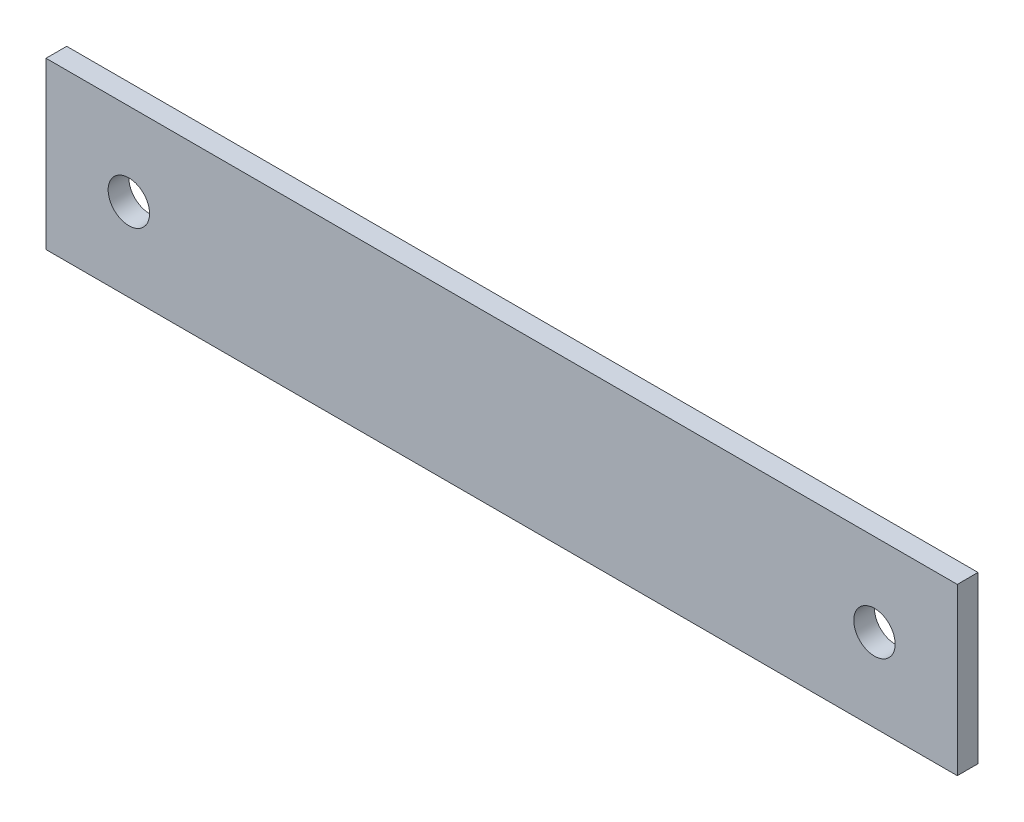
ISO-10303-21;
HEADER;
FILE_DESCRIPTION(('STEP AP214'),'2;1');
FILE_NAME('part.step','',(''),(''),'','','');
FILE_SCHEMA(('AUTOMOTIVE_DESIGN { 1 0 10303 214 1 1 1 1 }'));
ENDSEC;
DATA;
#1=APPLICATION_CONTEXT('core data for automotive mechanical design processes');
#2=APPLICATION_PROTOCOL_DEFINITION('international standard','automotive_design',2000,#1);
#3=PRODUCT_CONTEXT('',#1,'mechanical');
#4=PRODUCT('Part','Part','',(#3));
#5=PRODUCT_RELATED_PRODUCT_CATEGORY('part','',(#4));
#6=PRODUCT_DEFINITION_FORMATION('','',#4);
#7=PRODUCT_DEFINITION_CONTEXT('part definition',#1,'design');
#8=PRODUCT_DEFINITION('design','',#6,#7);
#9=PRODUCT_DEFINITION_SHAPE('','',#8);
#10=(LENGTH_UNIT() NAMED_UNIT(*) SI_UNIT(.MILLI.,.METRE.));
#11=(NAMED_UNIT(*) PLANE_ANGLE_UNIT() SI_UNIT($,.RADIAN.));
#12=(NAMED_UNIT(*) SI_UNIT($,.STERADIAN.) SOLID_ANGLE_UNIT());
#13=UNCERTAINTY_MEASURE_WITH_UNIT(LENGTH_MEASURE(1.E-05),#10,'distance_accuracy_value','');
#14=(GEOMETRIC_REPRESENTATION_CONTEXT(3) GLOBAL_UNCERTAINTY_ASSIGNED_CONTEXT((#13)) GLOBAL_UNIT_ASSIGNED_CONTEXT((#10,
#11,#12)) REPRESENTATION_CONTEXT('',''));
#15=CARTESIAN_POINT('',(0.,0.,0.));
#16=DIRECTION('',(0.,0.,1.));
#17=DIRECTION('',(1.,0.,0.));
#18=AXIS2_PLACEMENT_3D('',#15,#16,#17);
#19=CARTESIAN_POINT('',(0.,0.,3.175));
#20=DIRECTION('',(0.,0.,-1.));
#21=DIRECTION('',(-1.,0.,0.));
#22=AXIS2_PLACEMENT_3D('',#19,#20,#21);
#23=PLANE('',#22);
#24=CARTESIAN_POINT('',(12.7,12.7,3.175));
#25=DIRECTION('',(0.,0.,1.));
#26=DIRECTION('',(1.,0.,0.));
#27=AXIS2_PLACEMENT_3D('',#24,#25,#26);
#28=CIRCLE('',#27,3.175);
#29=CARTESIAN_POINT('',(15.875,12.7,3.175));
#30=VERTEX_POINT('',#29);
#31=EDGE_CURVE('E100',#30,#30,#28,.T.);
#32=ORIENTED_EDGE('',*,*,#31,.F.);
#33=EDGE_LOOP('',(#32));
#34=FACE_BOUND('',#33,.T.);
#35=DIRECTION('',(0.,-1.,0.));
#36=VECTOR('',#35,1.);
#37=CARTESIAN_POINT('',(0.,0.,3.175));
#38=LINE('',#37,#36);
#39=CARTESIAN_POINT('',(0.,25.4,3.175));
#40=VERTEX_POINT('',#39);
#41=CARTESIAN_POINT('',(0.,0.,3.175));
#42=VERTEX_POINT('',#41);
#43=EDGE_CURVE('E85',#40,#42,#38,.T.);
#44=ORIENTED_EDGE('',*,*,#43,.T.);
#45=DIRECTION('',(1.,0.,0.));
#46=VECTOR('',#45,1.);
#47=CARTESIAN_POINT('',(0.,0.,3.175));
#48=LINE('',#47,#46);
#49=CARTESIAN_POINT('',(139.7,0.,3.175));
#50=VERTEX_POINT('',#49);
#51=EDGE_CURVE('E80',#42,#50,#48,.T.);
#52=ORIENTED_EDGE('',*,*,#51,.T.);
#53=DIRECTION('',(0.,1.,0.));
#54=VECTOR('',#53,1.);
#55=CARTESIAN_POINT('',(139.7,0.,3.175));
#56=LINE('',#55,#54);
#57=CARTESIAN_POINT('',(139.7,25.4,3.175));
#58=VERTEX_POINT('',#57);
#59=EDGE_CURVE('E83',#50,#58,#56,.T.);
#60=ORIENTED_EDGE('',*,*,#59,.T.);
#61=DIRECTION('',(-1.,0.,0.));
#62=VECTOR('',#61,1.);
#63=CARTESIAN_POINT('',(0.,25.4,3.175));
#64=LINE('',#63,#62);
#65=EDGE_CURVE('E50',#58,#40,#64,.T.);
#66=ORIENTED_EDGE('',*,*,#65,.T.);
#67=EDGE_LOOP('',(#44,#52,#60,#66));
#68=FACE_BOUND('',#67,.T.);
#69=CARTESIAN_POINT('',(127.,12.7,3.175));
#70=DIRECTION('',(0.,0.,1.));
#71=DIRECTION('',(1.,0.,0.));
#72=AXIS2_PLACEMENT_3D('',#69,#70,#71);
#73=CIRCLE('',#72,3.175);
#74=CARTESIAN_POINT('',(130.175,12.7,3.175));
#75=VERTEX_POINT('',#74);
#76=EDGE_CURVE('E115',#75,#75,#73,.T.);
#77=ORIENTED_EDGE('',*,*,#76,.F.);
#78=EDGE_LOOP('',(#77));
#79=FACE_BOUND('',#78,.T.);
#80=ADVANCED_FACE('F33',(#34,#68,#79),#23,.F.);
#81=CARTESIAN_POINT('',(0.,0.,0.));
#82=DIRECTION('',(0.,0.,-1.));
#83=DIRECTION('',(-1.,0.,0.));
#84=AXIS2_PLACEMENT_3D('',#81,#82,#83);
#85=PLANE('',#84);
#86=CARTESIAN_POINT('',(12.7,12.7,0.));
#87=DIRECTION('',(0.,0.,1.));
#88=DIRECTION('',(1.,0.,0.));
#89=AXIS2_PLACEMENT_3D('',#86,#87,#88);
#90=CIRCLE('',#89,3.175);
#91=CARTESIAN_POINT('',(15.875,12.7,0.));
#92=VERTEX_POINT('',#91);
#93=EDGE_CURVE('E112',#92,#92,#90,.T.);
#94=ORIENTED_EDGE('',*,*,#93,.T.);
#95=EDGE_LOOP('',(#94));
#96=FACE_BOUND('',#95,.T.);
#97=DIRECTION('',(0.,-1.,0.));
#98=VECTOR('',#97,1.);
#99=CARTESIAN_POINT('',(0.,0.,0.));
#100=LINE('',#99,#98);
#101=CARTESIAN_POINT('',(0.,25.4,0.));
#102=VERTEX_POINT('',#101);
#103=CARTESIAN_POINT('',(0.,0.,0.));
#104=VERTEX_POINT('',#103);
#105=EDGE_CURVE('E97',#102,#104,#100,.T.);
#106=ORIENTED_EDGE('',*,*,#105,.F.);
#107=DIRECTION('',(-1.,0.,0.));
#108=VECTOR('',#107,1.);
#109=CARTESIAN_POINT('',(0.,25.4,0.));
#110=LINE('',#109,#108);
#111=CARTESIAN_POINT('',(139.7,25.4,0.));
#112=VERTEX_POINT('',#111);
#113=EDGE_CURVE('E73',#112,#102,#110,.T.);
#114=ORIENTED_EDGE('',*,*,#113,.F.);
#115=DIRECTION('',(0.,1.,0.));
#116=VECTOR('',#115,1.);
#117=CARTESIAN_POINT('',(139.7,0.,0.));
#118=LINE('',#117,#116);
#119=CARTESIAN_POINT('',(139.7,0.,0.));
#120=VERTEX_POINT('',#119);
#121=EDGE_CURVE('E67',#120,#112,#118,.T.);
#122=ORIENTED_EDGE('',*,*,#121,.F.);
#123=DIRECTION('',(1.,0.,0.));
#124=VECTOR('',#123,1.);
#125=CARTESIAN_POINT('',(0.,0.,0.));
#126=LINE('',#125,#124);
#127=EDGE_CURVE('E89',#104,#120,#126,.T.);
#128=ORIENTED_EDGE('',*,*,#127,.F.);
#129=EDGE_LOOP('',(#106,#114,#122,#128));
#130=FACE_BOUND('',#129,.T.);
#131=CARTESIAN_POINT('',(127.,12.7,0.));
#132=DIRECTION('',(0.,0.,1.));
#133=DIRECTION('',(1.,0.,0.));
#134=AXIS2_PLACEMENT_3D('',#131,#132,#133);
#135=CIRCLE('',#134,3.175);
#136=CARTESIAN_POINT('',(130.175,12.7,0.));
#137=VERTEX_POINT('',#136);
#138=EDGE_CURVE('E118',#137,#137,#135,.T.);
#139=ORIENTED_EDGE('',*,*,#138,.T.);
#140=EDGE_LOOP('',(#139));
#141=FACE_BOUND('',#140,.T.);
#142=ADVANCED_FACE('F108',(#96,#130,#141),#85,.T.);
#143=CARTESIAN_POINT('',(0.,0.,3.175));
#144=DIRECTION('',(1.,0.,0.));
#145=DIRECTION('',(0.,0.,-1.));
#146=AXIS2_PLACEMENT_3D('',#143,#144,#145);
#147=PLANE('',#146);
#148=ORIENTED_EDGE('',*,*,#105,.T.);
#149=DIRECTION('',(0.,0.,-1.));
#150=VECTOR('',#149,1.);
#151=CARTESIAN_POINT('',(0.,0.,3.175));
#152=LINE('',#151,#150);
#153=EDGE_CURVE('E11',#42,#104,#152,.T.);
#154=ORIENTED_EDGE('',*,*,#153,.F.);
#155=ORIENTED_EDGE('',*,*,#43,.F.);
#156=DIRECTION('',(0.,0.,-1.));
#157=VECTOR('',#156,1.);
#158=CARTESIAN_POINT('',(0.,25.4,3.175));
#159=LINE('',#158,#157);
#160=EDGE_CURVE('E93',#40,#102,#159,.T.);
#161=ORIENTED_EDGE('',*,*,#160,.T.);
#162=EDGE_LOOP('',(#148,#154,#155,#161));
#163=FACE_BOUND('',#162,.T.);
#164=ADVANCED_FACE('F35',(#163),#147,.F.);
#165=CARTESIAN_POINT('',(0.,0.,3.175));
#166=DIRECTION('',(0.,1.,0.));
#167=DIRECTION('',(0.,0.,1.));
#168=AXIS2_PLACEMENT_3D('',#165,#166,#167);
#169=PLANE('',#168);
#170=ORIENTED_EDGE('',*,*,#127,.T.);
#171=DIRECTION('',(0.,0.,-1.));
#172=VECTOR('',#171,1.);
#173=CARTESIAN_POINT('',(139.7,0.,3.175));
#174=LINE('',#173,#172);
#175=EDGE_CURVE('E42',#50,#120,#174,.T.);
#176=ORIENTED_EDGE('',*,*,#175,.F.);
#177=ORIENTED_EDGE('',*,*,#51,.F.);
#178=ORIENTED_EDGE('',*,*,#153,.T.);
#179=EDGE_LOOP('',(#170,#176,#177,#178));
#180=FACE_BOUND('',#179,.T.);
#181=ADVANCED_FACE('F88',(#180),#169,.F.);
#182=CARTESIAN_POINT('',(139.7,0.,3.175));
#183=DIRECTION('',(-1.,0.,0.));
#184=DIRECTION('',(0.,0.,1.));
#185=AXIS2_PLACEMENT_3D('',#182,#183,#184);
#186=PLANE('',#185);
#187=ORIENTED_EDGE('',*,*,#121,.T.);
#188=DIRECTION('',(0.,0.,-1.));
#189=VECTOR('',#188,1.);
#190=CARTESIAN_POINT('',(139.7,25.4,3.175));
#191=LINE('',#190,#189);
#192=EDGE_CURVE('E90',#58,#112,#191,.T.);
#193=ORIENTED_EDGE('',*,*,#192,.F.);
#194=ORIENTED_EDGE('',*,*,#59,.F.);
#195=ORIENTED_EDGE('',*,*,#175,.T.);
#196=EDGE_LOOP('',(#187,#193,#194,#195));
#197=FACE_BOUND('',#196,.T.);
#198=ADVANCED_FACE('F91',(#197),#186,.F.);
#199=CARTESIAN_POINT('',(0.,25.4,3.175));
#200=DIRECTION('',(0.,-1.,0.));
#201=DIRECTION('',(0.,0.,-1.));
#202=AXIS2_PLACEMENT_3D('',#199,#200,#201);
#203=PLANE('',#202);
#204=ORIENTED_EDGE('',*,*,#113,.T.);
#205=ORIENTED_EDGE('',*,*,#160,.F.);
#206=ORIENTED_EDGE('',*,*,#65,.F.);
#207=ORIENTED_EDGE('',*,*,#192,.T.);
#208=EDGE_LOOP('',(#204,#205,#206,#207));
#209=FACE_BOUND('',#208,.T.);
#210=ADVANCED_FACE('F105',(#209),#203,.F.);
#211=CARTESIAN_POINT('',(12.7,12.7,3.175));
#212=DIRECTION('',(0.,0.,-1.));
#213=DIRECTION('',(-1.,0.,0.));
#214=AXIS2_PLACEMENT_3D('',#211,#212,#213);
#215=CYLINDRICAL_SURFACE('',#214,3.175);
#216=ORIENTED_EDGE('',*,*,#31,.T.);
#217=EDGE_LOOP('',(#216));
#218=FACE_BOUND('',#217,.T.);
#219=ORIENTED_EDGE('',*,*,#93,.F.);
#220=EDGE_LOOP('',(#219));
#221=FACE_BOUND('',#220,.T.);
#222=ADVANCED_FACE('F136',(#218,#221),#215,.F.);
#223=CARTESIAN_POINT('',(127.,12.7,3.175));
#224=DIRECTION('',(0.,0.,-1.));
#225=DIRECTION('',(-1.,0.,0.));
#226=AXIS2_PLACEMENT_3D('',#223,#224,#225);
#227=CYLINDRICAL_SURFACE('',#226,3.175);
#228=ORIENTED_EDGE('',*,*,#76,.T.);
#229=EDGE_LOOP('',(#228));
#230=FACE_BOUND('',#229,.T.);
#231=ORIENTED_EDGE('',*,*,#138,.F.);
#232=EDGE_LOOP('',(#231));
#233=FACE_BOUND('',#232,.T.);
#234=ADVANCED_FACE('F124',(#230,#233),#227,.F.);
#235=CLOSED_SHELL('',(#80,#142,#164,#181,#198,#210,#222,#234));
#236=MANIFOLD_SOLID_BREP('B2',#235);
#237=ADVANCED_BREP_SHAPE_REPRESENTATION('',(#18,#236),#14);
#238=SHAPE_DEFINITION_REPRESENTATION(#9,#237);
ENDSEC;
END-ISO-10303-21;
